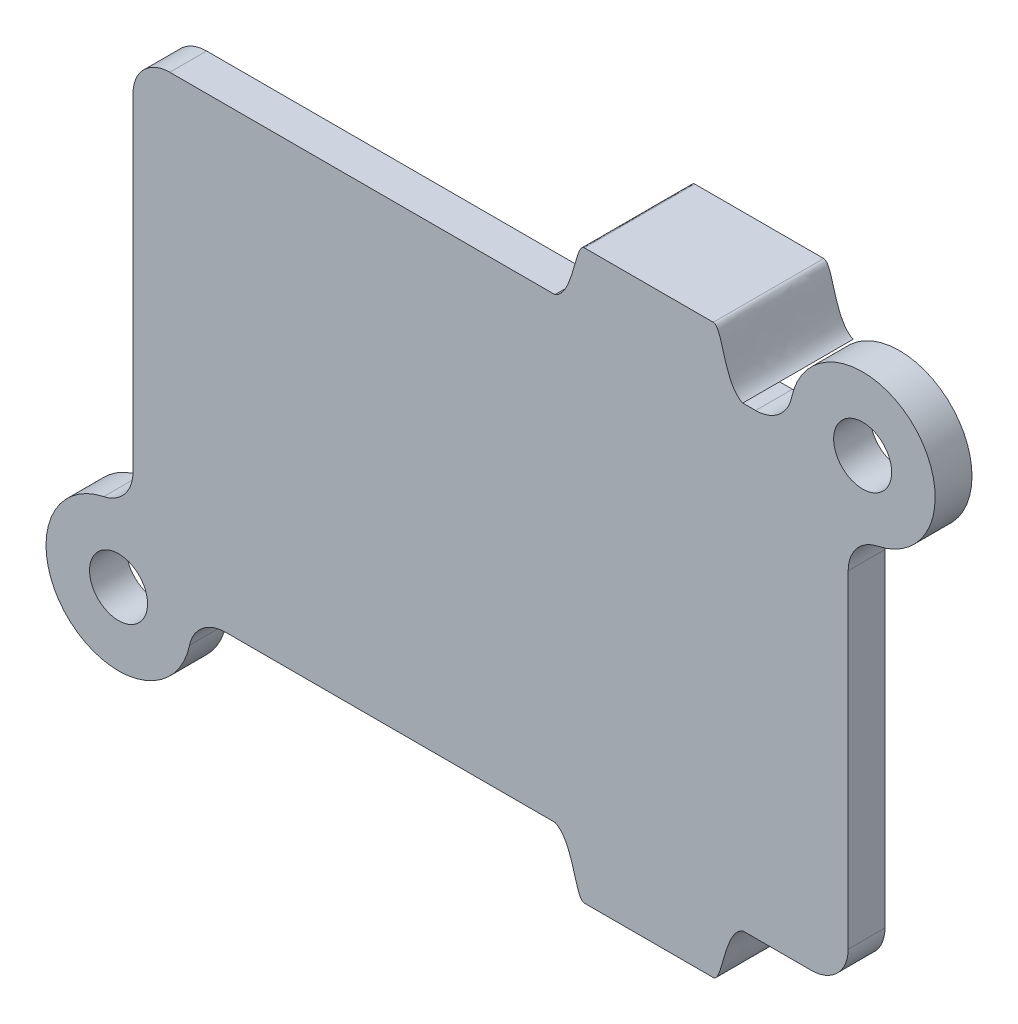
ISO-10303-21;
HEADER;
FILE_DESCRIPTION(('STEP AP214'),'2;1');
FILE_NAME('part.step','',(''),(''),'','','');
FILE_SCHEMA(('AUTOMOTIVE_DESIGN { 1 0 10303 214 1 1 1 1 }'));
ENDSEC;
DATA;
#1=APPLICATION_CONTEXT('core data for automotive mechanical design processes');
#2=APPLICATION_PROTOCOL_DEFINITION('international standard','automotive_design',2000,#1);
#3=PRODUCT_CONTEXT('',#1,'mechanical');
#4=PRODUCT('Part','Part','',(#3));
#5=PRODUCT_RELATED_PRODUCT_CATEGORY('part','',(#4));
#6=PRODUCT_DEFINITION_FORMATION('','',#4);
#7=PRODUCT_DEFINITION_CONTEXT('part definition',#1,'design');
#8=PRODUCT_DEFINITION('design','',#6,#7);
#9=PRODUCT_DEFINITION_SHAPE('','',#8);
#10=(LENGTH_UNIT() NAMED_UNIT(*) SI_UNIT(.MILLI.,.METRE.));
#11=(NAMED_UNIT(*) PLANE_ANGLE_UNIT() SI_UNIT($,.RADIAN.));
#12=(NAMED_UNIT(*) SI_UNIT($,.STERADIAN.) SOLID_ANGLE_UNIT());
#13=UNCERTAINTY_MEASURE_WITH_UNIT(LENGTH_MEASURE(1.E-05),#10,'distance_accuracy_value','');
#14=(GEOMETRIC_REPRESENTATION_CONTEXT(3) GLOBAL_UNCERTAINTY_ASSIGNED_CONTEXT((#13)) GLOBAL_UNIT_ASSIGNED_CONTEXT((#10,
#11,#12)) REPRESENTATION_CONTEXT('',''));
#15=CARTESIAN_POINT('',(0.,0.,0.));
#16=DIRECTION('',(0.,0.,1.));
#17=DIRECTION('',(1.,0.,0.));
#18=AXIS2_PLACEMENT_3D('',#15,#16,#17);
#19=CARTESIAN_POINT('',(0.,9.84105518988354,2.54));
#20=DIRECTION('',(0.,-1.,0.));
#21=DIRECTION('',(1.,0.,0.));
#22=AXIS2_PLACEMENT_3D('',#19,#20,#21);
#23=PLANE('',#22);
#24=DIRECTION('',(0.,0.,1.));
#25=VECTOR('',#24,1.);
#26=CARTESIAN_POINT('',(33.6454710930899,9.84105518988354,-5.08));
#27=LINE('',#26,#25);
#28=CARTESIAN_POINT('',(33.6454710930899,9.84105518988354,0.));
#29=VERTEX_POINT('',#28);
#30=CARTESIAN_POINT('',(33.6454710930899,9.84105518988354,2.54));
#31=VERTEX_POINT('',#30);
#32=EDGE_CURVE('E58',#29,#31,#27,.T.);
#33=ORIENTED_EDGE('',*,*,#32,.T.);
#34=DIRECTION('',(-1.,0.,0.));
#35=VECTOR('',#34,1.);
#36=CARTESIAN_POINT('',(0.,9.84105518988354,2.54));
#37=LINE('',#36,#35);
#38=CARTESIAN_POINT('',(34.5322363971184,9.84105518988354,2.54));
#39=VERTEX_POINT('',#38);
#40=EDGE_CURVE('E305',#39,#31,#37,.T.);
#41=ORIENTED_EDGE('',*,*,#40,.F.);
#42=DIRECTION('',(0.,0.,-1.));
#43=VECTOR('',#42,1.);
#44=CARTESIAN_POINT('',(34.5322363971184,9.84105518988354,2.54));
#45=LINE('',#44,#43);
#46=CARTESIAN_POINT('',(34.5322363971184,9.84105518988354,0.));
#47=VERTEX_POINT('',#46);
#48=EDGE_CURVE('E394',#39,#47,#45,.T.);
#49=ORIENTED_EDGE('',*,*,#48,.T.);
#50=DIRECTION('',(-1.,0.,0.));
#51=VECTOR('',#50,1.);
#52=CARTESIAN_POINT('',(0.,9.84105518988354,0.));
#53=LINE('',#52,#51);
#54=EDGE_CURVE('E345',#47,#29,#53,.T.);
#55=ORIENTED_EDGE('',*,*,#54,.T.);
#56=EDGE_LOOP('',(#33,#41,#49,#55));
#57=FACE_BOUND('',#56,.T.);
#58=ADVANCED_FACE('F35',(#57),#23,.F.);
#59=CARTESIAN_POINT('',(0.,-21.6930448101165,2.54));
#60=DIRECTION('',(0.,1.,0.));
#61=DIRECTION('',(0.,0.,1.));
#62=AXIS2_PLACEMENT_3D('',#59,#60,#61);
#63=PLANE('',#62);
#64=DIRECTION('',(0.,0.,1.));
#65=VECTOR('',#64,1.);
#66=CARTESIAN_POINT('',(20.6905883156182,-21.6930448101165,-5.08));
#67=LINE('',#66,#65);
#68=CARTESIAN_POINT('',(20.6905883156182,-21.6930448101165,0.));
#69=VERTEX_POINT('',#68);
#70=CARTESIAN_POINT('',(20.6905883156182,-21.6930448101165,2.54));
#71=VERTEX_POINT('',#70);
#72=EDGE_CURVE('E252',#69,#71,#67,.T.);
#73=ORIENTED_EDGE('',*,*,#72,.T.);
#74=DIRECTION('',(1.,0.,0.));
#75=VECTOR('',#74,1.);
#76=CARTESIAN_POINT('',(0.,-21.6930448101165,2.54));
#77=LINE('',#76,#75);
#78=CARTESIAN_POINT('',(-2.03457062658988,-21.6930448101165,2.54));
#79=VERTEX_POINT('',#78);
#80=EDGE_CURVE('E321',#79,#71,#77,.T.);
#81=ORIENTED_EDGE('',*,*,#80,.F.);
#82=DIRECTION('',(0.,0.,-1.));
#83=VECTOR('',#82,1.);
#84=CARTESIAN_POINT('',(-2.03457062658988,-21.6930448101165,2.54));
#85=LINE('',#84,#83);
#86=CARTESIAN_POINT('',(-2.03457062658988,-21.6930448101165,0.));
#87=VERTEX_POINT('',#86);
#88=EDGE_CURVE('E380',#79,#87,#85,.T.);
#89=ORIENTED_EDGE('',*,*,#88,.T.);
#90=DIRECTION('',(1.,0.,0.));
#91=VECTOR('',#90,1.);
#92=CARTESIAN_POINT('',(0.,-21.6930448101165,0.));
#93=LINE('',#92,#91);
#94=EDGE_CURVE('E364',#87,#69,#93,.T.);
#95=ORIENTED_EDGE('',*,*,#94,.T.);
#96=EDGE_LOOP('',(#73,#81,#89,#95));
#97=FACE_BOUND('',#96,.T.);
#98=ADVANCED_FACE('F466',(#97),#63,.F.);
#99=CARTESIAN_POINT('',(43.4585828852643,3.45470870173768,2.54));
#100=DIRECTION('',(0.,0.,-1.));
#101=DIRECTION('',(-1.,0.,0.));
#102=AXIS2_PLACEMENT_3D('',#99,#100,#101);
#103=CYLINDRICAL_SURFACE('',#102,2.54);
#104=CARTESIAN_POINT('',(43.4585828852643,3.45470870173768,0.));
#105=DIRECTION('',(0.,0.,1.));
#106=DIRECTION('',(1.,0.,0.));
#107=AXIS2_PLACEMENT_3D('',#104,#105,#106);
#108=CIRCLE('',#107,2.54);
#109=CARTESIAN_POINT('',(42.9394653471165,5.94109503165253,0.));
#110=VERTEX_POINT('',#109);
#111=CARTESIAN_POINT('',(40.9185828852643,3.45470870173768,0.));
#112=VERTEX_POINT('',#111);
#113=EDGE_CURVE('E335',#110,#112,#108,.T.);
#114=ORIENTED_EDGE('',*,*,#113,.F.);
#115=DIRECTION('',(0.,0.,-1.));
#116=VECTOR('',#115,1.);
#117=CARTESIAN_POINT('',(42.9394653471165,5.94109503165253,2.54));
#118=LINE('',#117,#116);
#119=CARTESIAN_POINT('',(42.9394653471165,5.94109503165253,2.54));
#120=VERTEX_POINT('',#119);
#121=EDGE_CURVE('E11',#120,#110,#118,.T.);
#122=ORIENTED_EDGE('',*,*,#121,.F.);
#123=CARTESIAN_POINT('',(43.4585828852643,3.45470870173768,2.54));
#124=DIRECTION('',(0.,0.,1.));
#125=DIRECTION('',(1.,0.,0.));
#126=AXIS2_PLACEMENT_3D('',#123,#124,#125);
#127=CIRCLE('',#126,2.54);
#128=CARTESIAN_POINT('',(40.9185828852643,3.45470870173768,2.54));
#129=VERTEX_POINT('',#128);
#130=EDGE_CURVE('E297',#120,#129,#127,.T.);
#131=ORIENTED_EDGE('',*,*,#130,.T.);
#132=DIRECTION('',(0.,0.,-1.));
#133=VECTOR('',#132,1.);
#134=CARTESIAN_POINT('',(40.9185828852643,3.45470870173768,2.54));
#135=LINE('',#134,#133);
#136=EDGE_CURVE('E329',#129,#112,#135,.T.);
#137=ORIENTED_EDGE('',*,*,#136,.T.);
#138=EDGE_LOOP('',(#114,#122,#131,#137));
#139=FACE_BOUND('',#138,.T.);
#140=ADVANCED_FACE('F414',(#139),#103,.F.);
#141=CARTESIAN_POINT('',(41.9168037969655,10.8392761015848,2.54));
#142=DIRECTION('',(0.,0.,-1.));
#143=DIRECTION('',(-1.,0.,0.));
#144=AXIS2_PLACEMENT_3D('',#141,#142,#143);
#145=CYLINDRICAL_SURFACE('',#144,5.0038);
#146=CARTESIAN_POINT('',(41.9168037969655,10.8392761015848,0.));
#147=DIRECTION('',(0.,0.,1.));
#148=DIRECTION('',(1.,0.,0.));
#149=AXIS2_PLACEMENT_3D('',#146,#147,#148);
#150=CIRCLE('',#149,5.0038);
#151=CARTESIAN_POINT('',(37.0186227270332,11.8619376517358,0.));
#152=VERTEX_POINT('',#151);
#153=EDGE_CURVE('E338',#110,#152,#150,.T.);
#154=ORIENTED_EDGE('',*,*,#153,.T.);
#155=DIRECTION('',(0.,0.,-1.));
#156=VECTOR('',#155,1.);
#157=CARTESIAN_POINT('',(37.0186227270332,11.8619376517358,2.54));
#158=LINE('',#157,#156);
#159=CARTESIAN_POINT('',(37.0186227270332,11.8619376517358,2.54));
#160=VERTEX_POINT('',#159);
#161=EDGE_CURVE('E43',#160,#152,#158,.T.);
#162=ORIENTED_EDGE('',*,*,#161,.F.);
#163=CARTESIAN_POINT('',(41.9168037969655,10.8392761015848,2.54));
#164=DIRECTION('',(0.,0.,1.));
#165=DIRECTION('',(1.,0.,0.));
#166=AXIS2_PLACEMENT_3D('',#163,#164,#165);
#167=CIRCLE('',#166,5.0038);
#168=EDGE_CURVE('E300',#120,#160,#167,.T.);
#169=ORIENTED_EDGE('',*,*,#168,.F.);
#170=ORIENTED_EDGE('',*,*,#121,.T.);
#171=EDGE_LOOP('',(#154,#162,#169,#170));
#172=FACE_BOUND('',#171,.T.);
#173=ADVANCED_FACE('F403',(#172),#145,.T.);
#174=CARTESIAN_POINT('',(34.5322363971184,12.3810551898835,2.54));
#175=DIRECTION('',(0.,0.,-1.));
#176=DIRECTION('',(-1.,0.,0.));
#177=AXIS2_PLACEMENT_3D('',#174,#175,#176);
#178=CYLINDRICAL_SURFACE('',#177,2.54);
#179=CARTESIAN_POINT('',(34.5322363971184,12.3810551898835,0.));
#180=DIRECTION('',(0.,0.,1.));
#181=DIRECTION('',(1.,0.,0.));
#182=AXIS2_PLACEMENT_3D('',#179,#180,#181);
#183=CIRCLE('',#182,2.54);
#184=EDGE_CURVE('E341',#47,#152,#183,.T.);
#185=ORIENTED_EDGE('',*,*,#184,.F.);
#186=ORIENTED_EDGE('',*,*,#48,.F.);
#187=CARTESIAN_POINT('',(34.5322363971184,12.3810551898835,2.54));
#188=DIRECTION('',(0.,0.,1.));
#189=DIRECTION('',(1.,0.,0.));
#190=AXIS2_PLACEMENT_3D('',#187,#188,#189);
#191=CIRCLE('',#190,2.54);
#192=EDGE_CURVE('E302',#39,#160,#191,.T.);
#193=ORIENTED_EDGE('',*,*,#192,.T.);
#194=ORIENTED_EDGE('',*,*,#161,.T.);
#195=EDGE_LOOP('',(#185,#186,#193,#194));
#196=FACE_BOUND('',#195,.T.);
#197=ADVANCED_FACE('F398',(#196),#178,.F.);
#198=CARTESIAN_POINT('',(20.6905883156182,9.84105518988354,2.54));
#199=VERTEX_POINT('',#198);
#200=CARTESIAN_POINT('',(-5.88091711473574,9.84105518988354,2.54));
#201=VERTEX_POINT('',#200);
#202=EDGE_CURVE('E50',#199,#201,#37,.T.);
#203=ORIENTED_EDGE('',*,*,#202,.F.);
#204=DIRECTION('',(0.,0.,1.));
#205=VECTOR('',#204,1.);
#206=CARTESIAN_POINT('',(20.6905883156182,9.84105518988354,-5.08));
#207=LINE('',#206,#205);
#208=CARTESIAN_POINT('',(20.6905883156182,9.84105518988354,0.));
#209=VERTEX_POINT('',#208);
#210=EDGE_CURVE('E765',#209,#199,#207,.T.);
#211=ORIENTED_EDGE('',*,*,#210,.F.);
#212=CARTESIAN_POINT('',(-5.88091711473574,9.84105518988354,0.));
#213=VERTEX_POINT('',#212);
#214=EDGE_CURVE('E344',#209,#213,#53,.T.);
#215=ORIENTED_EDGE('',*,*,#214,.T.);
#216=DIRECTION('',(0.,0.,-1.));
#217=VECTOR('',#216,1.);
#218=CARTESIAN_POINT('',(-5.88091711473574,9.84105518988354,2.54));
#219=LINE('',#218,#217);
#220=EDGE_CURVE('E391',#201,#213,#219,.T.);
#221=ORIENTED_EDGE('',*,*,#220,.F.);
#222=EDGE_LOOP('',(#203,#211,#215,#221));
#223=FACE_BOUND('',#222,.T.);
#224=ADVANCED_FACE('F485',(#223),#23,.F.);
#225=CARTESIAN_POINT('',(-5.88091711473574,7.30105518988354,2.54));
#226=DIRECTION('',(0.,0.,-1.));
#227=DIRECTION('',(-1.,0.,0.));
#228=AXIS2_PLACEMENT_3D('',#225,#226,#227);
#229=CYLINDRICAL_SURFACE('',#228,2.54);
#230=CARTESIAN_POINT('',(-5.88091711473574,7.30105518988354,0.));
#231=DIRECTION('',(0.,0.,1.));
#232=DIRECTION('',(1.,0.,0.));
#233=AXIS2_PLACEMENT_3D('',#230,#231,#232);
#234=CIRCLE('',#233,2.54);
#235=CARTESIAN_POINT('',(-8.42091711473574,7.30105518988354,0.));
#236=VERTEX_POINT('',#235);
#237=EDGE_CURVE('E347',#213,#236,#234,.T.);
#238=ORIENTED_EDGE('',*,*,#237,.T.);
#239=DIRECTION('',(0.,0.,-1.));
#240=VECTOR('',#239,1.);
#241=CARTESIAN_POINT('',(-8.42091711473574,7.30105518988354,2.54));
#242=LINE('',#241,#240);
#243=CARTESIAN_POINT('',(-8.42091711473574,7.30105518988354,2.54));
#244=VERTEX_POINT('',#243);
#245=EDGE_CURVE('E388',#244,#236,#242,.T.);
#246=ORIENTED_EDGE('',*,*,#245,.F.);
#247=CARTESIAN_POINT('',(-5.88091711473574,7.30105518988354,2.54));
#248=DIRECTION('',(0.,0.,1.));
#249=DIRECTION('',(1.,0.,0.));
#250=AXIS2_PLACEMENT_3D('',#247,#248,#249);
#251=CIRCLE('',#250,2.54);
#252=EDGE_CURVE('E307',#201,#244,#251,.T.);
#253=ORIENTED_EDGE('',*,*,#252,.F.);
#254=ORIENTED_EDGE('',*,*,#220,.T.);
#255=EDGE_LOOP('',(#238,#246,#253,#254));
#256=FACE_BOUND('',#255,.T.);
#257=ADVANCED_FACE('F481',(#256),#229,.T.);
#258=CARTESIAN_POINT('',(-8.42091711473574,0.,2.54));
#259=DIRECTION('',(1.,0.,0.));
#260=DIRECTION('',(0.,0.,-1.));
#261=AXIS2_PLACEMENT_3D('',#258,#259,#260);
#262=PLANE('',#261);
#263=DIRECTION('',(0.,-1.,0.));
#264=VECTOR('',#263,1.);
#265=CARTESIAN_POINT('',(-8.42091711473574,0.,0.));
#266=LINE('',#265,#264);
#267=CARTESIAN_POINT('',(-8.42091711473574,-15.3066983219706,0.));
#268=VERTEX_POINT('',#267);
#269=EDGE_CURVE('E351',#236,#268,#266,.T.);
#270=ORIENTED_EDGE('',*,*,#269,.T.);
#271=DIRECTION('',(0.,0.,-1.));
#272=VECTOR('',#271,1.);
#273=CARTESIAN_POINT('',(-8.42091711473574,-15.3066983219706,2.54));
#274=LINE('',#273,#272);
#275=CARTESIAN_POINT('',(-8.42091711473574,-15.3066983219706,2.54));
#276=VERTEX_POINT('',#275);
#277=EDGE_CURVE('E386',#276,#268,#274,.T.);
#278=ORIENTED_EDGE('',*,*,#277,.F.);
#279=DIRECTION('',(0.,-1.,0.));
#280=VECTOR('',#279,1.);
#281=CARTESIAN_POINT('',(-8.42091711473574,0.,2.54));
#282=LINE('',#281,#280);
#283=EDGE_CURVE('E310',#244,#276,#282,.T.);
#284=ORIENTED_EDGE('',*,*,#283,.F.);
#285=ORIENTED_EDGE('',*,*,#245,.T.);
#286=EDGE_LOOP('',(#270,#278,#284,#285));
#287=FACE_BOUND('',#286,.T.);
#288=ADVANCED_FACE('F477',(#287),#262,.F.);
#289=CARTESIAN_POINT('',(-10.9609171147357,-15.3066983219706,2.54));
#290=DIRECTION('',(0.,0.,-1.));
#291=DIRECTION('',(-1.,0.,0.));
#292=AXIS2_PLACEMENT_3D('',#289,#290,#291);
#293=CYLINDRICAL_SURFACE('',#292,2.54);
#294=CARTESIAN_POINT('',(-10.9609171147357,-15.3066983219706,0.));
#295=DIRECTION('',(0.,0.,1.));
#296=DIRECTION('',(1.,0.,0.));
#297=AXIS2_PLACEMENT_3D('',#294,#295,#296);
#298=CIRCLE('',#297,2.54);
#299=CARTESIAN_POINT('',(-10.441799576588,-17.7930846518854,0.));
#300=VERTEX_POINT('',#299);
#301=EDGE_CURVE('E354',#300,#268,#298,.T.);
#302=ORIENTED_EDGE('',*,*,#301,.F.);
#303=DIRECTION('',(0.,0.,-1.));
#304=VECTOR('',#303,1.);
#305=CARTESIAN_POINT('',(-10.441799576588,-17.7930846518854,2.54));
#306=LINE('',#305,#304);
#307=CARTESIAN_POINT('',(-10.441799576588,-17.7930846518854,2.54));
#308=VERTEX_POINT('',#307);
#309=EDGE_CURVE('E384',#308,#300,#306,.T.);
#310=ORIENTED_EDGE('',*,*,#309,.F.);
#311=CARTESIAN_POINT('',(-10.9609171147357,-15.3066983219706,2.54));
#312=DIRECTION('',(0.,0.,1.));
#313=DIRECTION('',(1.,0.,0.));
#314=AXIS2_PLACEMENT_3D('',#311,#312,#313);
#315=CIRCLE('',#314,2.54);
#316=EDGE_CURVE('E312',#308,#276,#315,.T.);
#317=ORIENTED_EDGE('',*,*,#316,.T.);
#318=ORIENTED_EDGE('',*,*,#277,.T.);
#319=EDGE_LOOP('',(#302,#310,#317,#318));
#320=FACE_BOUND('',#319,.T.);
#321=ADVANCED_FACE('F473',(#320),#293,.F.);
#322=CARTESIAN_POINT('',(-9.41913802643698,-22.6912657218177,2.54));
#323=DIRECTION('',(0.,0.,-1.));
#324=DIRECTION('',(-1.,0.,0.));
#325=AXIS2_PLACEMENT_3D('',#322,#323,#324);
#326=CYLINDRICAL_SURFACE('',#325,5.0038);
#327=CARTESIAN_POINT('',(-9.41913802643698,-22.6912657218177,0.));
#328=DIRECTION('',(0.,0.,1.));
#329=DIRECTION('',(1.,0.,0.));
#330=AXIS2_PLACEMENT_3D('',#327,#328,#329);
#331=CIRCLE('',#330,5.0038);
#332=CARTESIAN_POINT('',(-4.52095695650473,-23.7139272719687,0.));
#333=VERTEX_POINT('',#332);
#334=EDGE_CURVE('E357',#300,#333,#331,.T.);
#335=ORIENTED_EDGE('',*,*,#334,.T.);
#336=DIRECTION('',(0.,0.,-1.));
#337=VECTOR('',#336,1.);
#338=CARTESIAN_POINT('',(-4.52095695650473,-23.7139272719687,2.54));
#339=LINE('',#338,#337);
#340=CARTESIAN_POINT('',(-4.52095695650473,-23.7139272719687,2.54));
#341=VERTEX_POINT('',#340);
#342=EDGE_CURVE('E382',#341,#333,#339,.T.);
#343=ORIENTED_EDGE('',*,*,#342,.F.);
#344=CARTESIAN_POINT('',(-9.41913802643698,-22.6912657218177,2.54));
#345=DIRECTION('',(0.,0.,1.));
#346=DIRECTION('',(1.,0.,0.));
#347=AXIS2_PLACEMENT_3D('',#344,#345,#346);
#348=CIRCLE('',#347,5.0038);
#349=EDGE_CURVE('E315',#308,#341,#348,.T.);
#350=ORIENTED_EDGE('',*,*,#349,.F.);
#351=ORIENTED_EDGE('',*,*,#309,.T.);
#352=EDGE_LOOP('',(#335,#343,#350,#351));
#353=FACE_BOUND('',#352,.T.);
#354=ADVANCED_FACE('F469',(#353),#326,.T.);
#355=CARTESIAN_POINT('',(-2.03457062658988,-24.2330448101165,2.54));
#356=DIRECTION('',(0.,0.,-1.));
#357=DIRECTION('',(-1.,0.,0.));
#358=AXIS2_PLACEMENT_3D('',#355,#356,#357);
#359=CYLINDRICAL_SURFACE('',#358,2.54);
#360=CARTESIAN_POINT('',(-2.03457062658988,-24.2330448101165,0.));
#361=DIRECTION('',(0.,0.,1.));
#362=DIRECTION('',(1.,0.,0.));
#363=AXIS2_PLACEMENT_3D('',#360,#361,#362);
#364=CIRCLE('',#363,2.54);
#365=EDGE_CURVE('E360',#87,#333,#364,.T.);
#366=ORIENTED_EDGE('',*,*,#365,.F.);
#367=ORIENTED_EDGE('',*,*,#88,.F.);
#368=CARTESIAN_POINT('',(-2.03457062658988,-24.2330448101165,2.54));
#369=DIRECTION('',(0.,0.,1.));
#370=DIRECTION('',(1.,0.,0.));
#371=AXIS2_PLACEMENT_3D('',#368,#369,#370);
#372=CIRCLE('',#371,2.54);
#373=EDGE_CURVE('E317',#79,#341,#372,.T.);
#374=ORIENTED_EDGE('',*,*,#373,.T.);
#375=ORIENTED_EDGE('',*,*,#342,.T.);
#376=EDGE_LOOP('',(#366,#367,#374,#375));
#377=FACE_BOUND('',#376,.T.);
#378=ADVANCED_FACE('F465',(#377),#359,.F.);
#379=CARTESIAN_POINT('',(33.6454710930899,-21.6930448101165,2.54));
#380=VERTEX_POINT('',#379);
#381=CARTESIAN_POINT('',(38.3785828852643,-21.6930448101165,2.54));
#382=VERTEX_POINT('',#381);
#383=EDGE_CURVE('E320',#380,#382,#77,.T.);
#384=ORIENTED_EDGE('',*,*,#383,.F.);
#385=DIRECTION('',(0.,0.,1.));
#386=VECTOR('',#385,1.);
#387=CARTESIAN_POINT('',(33.6454710930899,-21.6930448101165,-5.08));
#388=LINE('',#387,#386);
#389=CARTESIAN_POINT('',(33.6454710930899,-21.6930448101165,0.));
#390=VERTEX_POINT('',#389);
#391=EDGE_CURVE('E282',#390,#380,#388,.T.);
#392=ORIENTED_EDGE('',*,*,#391,.F.);
#393=CARTESIAN_POINT('',(38.3785828852643,-21.6930448101165,0.));
#394=VERTEX_POINT('',#393);
#395=EDGE_CURVE('E363',#390,#394,#93,.T.);
#396=ORIENTED_EDGE('',*,*,#395,.T.);
#397=DIRECTION('',(0.,0.,-1.));
#398=VECTOR('',#397,1.);
#399=CARTESIAN_POINT('',(38.3785828852643,-21.6930448101165,2.54));
#400=LINE('',#399,#398);
#401=EDGE_CURVE('E377',#382,#394,#400,.T.);
#402=ORIENTED_EDGE('',*,*,#401,.F.);
#403=EDGE_LOOP('',(#384,#392,#396,#402));
#404=FACE_BOUND('',#403,.T.);
#405=ADVANCED_FACE('F424',(#404),#63,.F.);
#406=CARTESIAN_POINT('',(38.3785828852643,-19.1530448101165,2.54));
#407=DIRECTION('',(0.,0.,-1.));
#408=DIRECTION('',(-1.,0.,0.));
#409=AXIS2_PLACEMENT_3D('',#406,#407,#408);
#410=CYLINDRICAL_SURFACE('',#409,2.54);
#411=CARTESIAN_POINT('',(38.3785828852643,-19.1530448101165,0.));
#412=DIRECTION('',(0.,0.,1.));
#413=DIRECTION('',(1.,0.,0.));
#414=AXIS2_PLACEMENT_3D('',#411,#412,#413);
#415=CIRCLE('',#414,2.54);
#416=CARTESIAN_POINT('',(40.9185828852643,-19.1530448101165,0.));
#417=VERTEX_POINT('',#416);
#418=EDGE_CURVE('E367',#394,#417,#415,.T.);
#419=ORIENTED_EDGE('',*,*,#418,.T.);
#420=DIRECTION('',(0.,0.,-1.));
#421=VECTOR('',#420,1.);
#422=CARTESIAN_POINT('',(40.9185828852643,-19.1530448101165,2.54));
#423=LINE('',#422,#421);
#424=CARTESIAN_POINT('',(40.9185828852643,-19.1530448101165,2.54));
#425=VERTEX_POINT('',#424);
#426=EDGE_CURVE('E374',#425,#417,#423,.T.);
#427=ORIENTED_EDGE('',*,*,#426,.F.);
#428=CARTESIAN_POINT('',(38.3785828852643,-19.1530448101165,2.54));
#429=DIRECTION('',(0.,0.,1.));
#430=DIRECTION('',(1.,0.,0.));
#431=AXIS2_PLACEMENT_3D('',#428,#429,#430);
#432=CIRCLE('',#431,2.54);
#433=EDGE_CURVE('E324',#382,#425,#432,.T.);
#434=ORIENTED_EDGE('',*,*,#433,.F.);
#435=ORIENTED_EDGE('',*,*,#401,.T.);
#436=EDGE_LOOP('',(#419,#427,#434,#435));
#437=FACE_BOUND('',#436,.T.);
#438=ADVANCED_FACE('F421',(#437),#410,.T.);
#439=CARTESIAN_POINT('',(41.9168037969655,10.8392761015848,2.54));
#440=DIRECTION('',(0.,0.,-1.));
#441=DIRECTION('',(-1.,0.,0.));
#442=AXIS2_PLACEMENT_3D('',#439,#440,#441);
#443=CYLINDRICAL_SURFACE('',#442,2.);
#444=CARTESIAN_POINT('',(41.9168037969655,10.8392761015848,2.54));
#445=DIRECTION('',(0.,0.,1.));
#446=DIRECTION('',(1.,0.,0.));
#447=AXIS2_PLACEMENT_3D('',#444,#445,#446);
#448=CIRCLE('',#447,2.);
#449=CARTESIAN_POINT('',(43.9168037969655,10.8392761015848,2.54));
#450=VERTEX_POINT('',#449);
#451=EDGE_CURVE('E293',#450,#450,#448,.T.);
#452=ORIENTED_EDGE('',*,*,#451,.T.);
#453=EDGE_LOOP('',(#452));
#454=FACE_BOUND('',#453,.T.);
#455=CARTESIAN_POINT('',(41.9168037969655,10.8392761015848,0.));
#456=DIRECTION('',(0.,0.,1.));
#457=DIRECTION('',(1.,0.,0.));
#458=AXIS2_PLACEMENT_3D('',#455,#456,#457);
#459=CIRCLE('',#458,2.);
#460=CARTESIAN_POINT('',(43.9168037969655,10.8392761015848,0.));
#461=VERTEX_POINT('',#460);
#462=EDGE_CURVE('E332',#461,#461,#459,.T.);
#463=ORIENTED_EDGE('',*,*,#462,.F.);
#464=EDGE_LOOP('',(#463));
#465=FACE_BOUND('',#464,.T.);
#466=ADVANCED_FACE('F462',(#454,#465),#443,.F.);
#467=CARTESIAN_POINT('',(-9.41913802643698,-22.6912657218177,2.54));
#468=DIRECTION('',(0.,0.,-1.));
#469=DIRECTION('',(-1.,0.,0.));
#470=AXIS2_PLACEMENT_3D('',#467,#468,#469);
#471=CYLINDRICAL_SURFACE('',#470,2.);
#472=CARTESIAN_POINT('',(-9.41913802643698,-22.6912657218177,2.54));
#473=DIRECTION('',(0.,0.,1.));
#474=DIRECTION('',(1.,0.,0.));
#475=AXIS2_PLACEMENT_3D('',#472,#473,#474);
#476=CIRCLE('',#475,2.);
#477=CARTESIAN_POINT('',(-7.41913802643698,-22.6912657218177,2.54));
#478=VERTEX_POINT('',#477);
#479=EDGE_CURVE('E290',#478,#478,#476,.T.);
#480=ORIENTED_EDGE('',*,*,#479,.T.);
#481=EDGE_LOOP('',(#480));
#482=FACE_BOUND('',#481,.T.);
#483=CARTESIAN_POINT('',(-9.41913802643698,-22.6912657218177,0.));
#484=DIRECTION('',(0.,0.,1.));
#485=DIRECTION('',(1.,0.,0.));
#486=AXIS2_PLACEMENT_3D('',#483,#484,#485);
#487=CIRCLE('',#486,2.);
#488=CARTESIAN_POINT('',(-7.41913802643698,-22.6912657218177,0.));
#489=VERTEX_POINT('',#488);
#490=EDGE_CURVE('E281',#489,#489,#487,.T.);
#491=ORIENTED_EDGE('',*,*,#490,.F.);
#492=EDGE_LOOP('',(#491));
#493=FACE_BOUND('',#492,.T.);
#494=ADVANCED_FACE('F37',(#482,#493),#471,.F.);
#495=CARTESIAN_POINT('',(40.9185828852643,0.,2.54));
#496=DIRECTION('',(-1.,0.,0.));
#497=DIRECTION('',(0.,0.,1.));
#498=AXIS2_PLACEMENT_3D('',#495,#496,#497);
#499=PLANE('',#498);
#500=DIRECTION('',(0.,1.,0.));
#501=VECTOR('',#500,1.);
#502=CARTESIAN_POINT('',(40.9185828852643,0.,0.));
#503=LINE('',#502,#501);
#504=EDGE_CURVE('E294',#417,#112,#503,.T.);
#505=ORIENTED_EDGE('',*,*,#504,.T.);
#506=ORIENTED_EDGE('',*,*,#136,.F.);
#507=DIRECTION('',(0.,1.,0.));
#508=VECTOR('',#507,1.);
#509=CARTESIAN_POINT('',(40.9185828852643,0.,2.54));
#510=LINE('',#509,#508);
#511=EDGE_CURVE('E327',#425,#129,#510,.T.);
#512=ORIENTED_EDGE('',*,*,#511,.F.);
#513=ORIENTED_EDGE('',*,*,#426,.T.);
#514=EDGE_LOOP('',(#505,#506,#512,#513));
#515=FACE_BOUND('',#514,.T.);
#516=ADVANCED_FACE('F418',(#515),#499,.F.);
#517=CARTESIAN_POINT('',(0.,0.,2.54));
#518=DIRECTION('',(0.,0.,1.));
#519=DIRECTION('',(1.,0.,0.));
#520=AXIS2_PLACEMENT_3D('',#517,#518,#519);
#521=PLANE('',#520);
#522=ORIENTED_EDGE('',*,*,#479,.F.);
#523=EDGE_LOOP('',(#522));
#524=FACE_BOUND('',#523,.T.);
#525=ORIENTED_EDGE('',*,*,#451,.F.);
#526=EDGE_LOOP('',(#525));
#527=FACE_BOUND('',#526,.T.);
#528=ORIENTED_EDGE('',*,*,#130,.F.);
#529=ORIENTED_EDGE('',*,*,#168,.T.);
#530=ORIENTED_EDGE('',*,*,#192,.F.);
#531=ORIENTED_EDGE('',*,*,#40,.T.);
#532=CARTESIAN_POINT('',(31.6130297043541,13.6510551898835,2.54));
#533=CARTESIAN_POINT('',(32.285115867015,13.6510551898835,2.54));
#534=CARTESIAN_POINT('',(32.3165184257959,10.4273707205446,2.54));
#535=CARTESIAN_POINT('',(33.6454710930899,9.84105518988354,2.54));
#536=B_SPLINE_CURVE_WITH_KNOTS('',3,(#532,#533,#534,#535),.UNSPECIFIED.,.F.,.F.,(4,4),(0.,1.),.UNSPECIFIED.);
#537=CARTESIAN_POINT('',(31.6130297043541,13.6510551898835,2.54));
#538=VERTEX_POINT('',#537);
#539=EDGE_CURVE('E748',#538,#31,#536,.T.);
#540=ORIENTED_EDGE('',*,*,#539,.F.);
#541=DIRECTION('',(1.,0.,0.));
#542=VECTOR('',#541,1.);
#543=CARTESIAN_POINT('',(0.,13.6510551898835,2.54));
#544=LINE('',#543,#542);
#545=CARTESIAN_POINT('',(22.7230297043541,13.6510551898835,2.54));
#546=VERTEX_POINT('',#545);
#547=EDGE_CURVE('E213',#546,#538,#544,.T.);
#548=ORIENTED_EDGE('',*,*,#547,.F.);
#549=CARTESIAN_POINT('',(22.7230297043541,13.6510551898835,2.54));
#550=CARTESIAN_POINT('',(22.0509435416931,13.6510551898835,2.54));
#551=CARTESIAN_POINT('',(22.0195409829123,10.4273707205446,2.54));
#552=CARTESIAN_POINT('',(20.6905883156182,9.84105518988354,2.54));
#553=B_SPLINE_CURVE_WITH_KNOTS('',3,(#549,#550,#551,#552),.UNSPECIFIED.,.F.,.F.,(4,4),(0.,1.),.UNSPECIFIED.);
#554=EDGE_CURVE('E210',#546,#199,#553,.T.);
#555=ORIENTED_EDGE('',*,*,#554,.T.);
#556=ORIENTED_EDGE('',*,*,#202,.T.);
#557=ORIENTED_EDGE('',*,*,#252,.T.);
#558=ORIENTED_EDGE('',*,*,#283,.T.);
#559=ORIENTED_EDGE('',*,*,#316,.F.);
#560=ORIENTED_EDGE('',*,*,#349,.T.);
#561=ORIENTED_EDGE('',*,*,#373,.F.);
#562=ORIENTED_EDGE('',*,*,#80,.T.);
#563=CARTESIAN_POINT('',(22.7230297043541,-25.5030448101164,2.54));
#564=CARTESIAN_POINT('',(22.0509435416931,-25.5030448101164,2.54));
#565=CARTESIAN_POINT('',(22.0195409829123,-22.2793603407775,2.54));
#566=CARTESIAN_POINT('',(20.6905883156182,-21.6930448101165,2.54));
#567=B_SPLINE_CURVE_WITH_KNOTS('',3,(#563,#564,#565,#566),.UNSPECIFIED.,.F.,.F.,(4,4),(0.,1.),.UNSPECIFIED.);
#568=CARTESIAN_POINT('',(22.7230297043541,-25.5030448101165,2.54));
#569=VERTEX_POINT('',#568);
#570=EDGE_CURVE('E255',#569,#71,#567,.T.);
#571=ORIENTED_EDGE('',*,*,#570,.F.);
#572=DIRECTION('',(1.,0.,0.));
#573=VECTOR('',#572,1.);
#574=CARTESIAN_POINT('',(0.,-25.5030448101165,2.54));
#575=LINE('',#574,#573);
#576=CARTESIAN_POINT('',(31.6130297043541,-25.5030448101165,2.54));
#577=VERTEX_POINT('',#576);
#578=EDGE_CURVE('E263',#569,#577,#575,.T.);
#579=ORIENTED_EDGE('',*,*,#578,.T.);
#580=CARTESIAN_POINT('',(31.6130297043541,-25.5030448101164,2.54));
#581=CARTESIAN_POINT('',(32.285115867015,-25.5030448101164,2.54));
#582=CARTESIAN_POINT('',(32.3165184257959,-22.2793603407775,2.54));
#583=CARTESIAN_POINT('',(33.6454710930899,-21.6930448101165,2.54));
#584=B_SPLINE_CURVE_WITH_KNOTS('',3,(#580,#581,#582,#583),.UNSPECIFIED.,.F.,.F.,(4,4),(0.,1.),.UNSPECIFIED.);
#585=EDGE_CURVE('E269',#577,#380,#584,.T.);
#586=ORIENTED_EDGE('',*,*,#585,.T.);
#587=ORIENTED_EDGE('',*,*,#383,.T.);
#588=ORIENTED_EDGE('',*,*,#433,.T.);
#589=ORIENTED_EDGE('',*,*,#511,.T.);
#590=EDGE_LOOP('',(#528,#529,#530,#531,#540,#548,#555,#556,#557,#558,#559,#560,#561,#562,#571,
#579,#586,#587,#588,#589));
#591=FACE_BOUND('',#590,.T.);
#592=ADVANCED_FACE('F411',(#524,#527,#591),#521,.T.);
#593=CARTESIAN_POINT('',(0.,0.,0.));
#594=DIRECTION('',(0.,0.,1.));
#595=DIRECTION('',(1.,0.,0.));
#596=AXIS2_PLACEMENT_3D('',#593,#594,#595);
#597=PLANE('',#596);
#598=ORIENTED_EDGE('',*,*,#490,.T.);
#599=EDGE_LOOP('',(#598));
#600=FACE_BOUND('',#599,.T.);
#601=ORIENTED_EDGE('',*,*,#462,.T.);
#602=EDGE_LOOP('',(#601));
#603=FACE_BOUND('',#602,.T.);
#604=ORIENTED_EDGE('',*,*,#113,.T.);
#605=ORIENTED_EDGE('',*,*,#504,.F.);
#606=ORIENTED_EDGE('',*,*,#418,.F.);
#607=ORIENTED_EDGE('',*,*,#395,.F.);
#608=EDGE_CURVE('E368',#69,#390,#93,.T.);
#609=ORIENTED_EDGE('',*,*,#608,.F.);
#610=ORIENTED_EDGE('',*,*,#94,.F.);
#611=ORIENTED_EDGE('',*,*,#365,.T.);
#612=ORIENTED_EDGE('',*,*,#334,.F.);
#613=ORIENTED_EDGE('',*,*,#301,.T.);
#614=ORIENTED_EDGE('',*,*,#269,.F.);
#615=ORIENTED_EDGE('',*,*,#237,.F.);
#616=ORIENTED_EDGE('',*,*,#214,.F.);
#617=EDGE_CURVE('E348',#29,#209,#53,.T.);
#618=ORIENTED_EDGE('',*,*,#617,.F.);
#619=ORIENTED_EDGE('',*,*,#54,.F.);
#620=ORIENTED_EDGE('',*,*,#184,.T.);
#621=ORIENTED_EDGE('',*,*,#153,.F.);
#622=EDGE_LOOP('',(#604,#605,#606,#607,#609,#610,#611,#612,#613,#614,#615,#616,#618,#619,#620,#621));
#623=FACE_BOUND('',#622,.T.);
#624=ADVANCED_FACE('F407',(#600,#603,#623),#597,.F.);
#625=CARTESIAN_POINT('',(0.,-21.6930448101165,-5.08));
#626=DIRECTION('',(0.,-1.,0.));
#627=DIRECTION('',(0.,0.,-1.));
#628=AXIS2_PLACEMENT_3D('',#625,#626,#627);
#629=PLANE('',#628);
#630=CARTESIAN_POINT('',(20.6905883156182,-21.6930448101165,-5.08));
#631=VERTEX_POINT('',#630);
#632=EDGE_CURVE('E287',#631,#69,#67,.T.);
#633=ORIENTED_EDGE('',*,*,#632,.T.);
#634=ORIENTED_EDGE('',*,*,#608,.T.);
#635=CARTESIAN_POINT('',(33.6454710930899,-21.6930448101165,-5.08));
#636=VERTEX_POINT('',#635);
#637=EDGE_CURVE('E275',#636,#390,#388,.T.);
#638=ORIENTED_EDGE('',*,*,#637,.F.);
#639=DIRECTION('',(1.,0.,0.));
#640=VECTOR('',#639,1.);
#641=CARTESIAN_POINT('',(0.,-21.6930448101165,-5.08));
#642=LINE('',#641,#640);
#643=EDGE_CURVE('E274',#631,#636,#642,.T.);
#644=ORIENTED_EDGE('',*,*,#643,.F.);
#645=EDGE_LOOP('',(#633,#634,#638,#644));
#646=FACE_BOUND('',#645,.T.);
#647=ADVANCED_FACE('F242',(#646),#629,.F.);
#648=CARTESIAN_POINT('',(31.6130297043541,-25.5030448101164,-5.08));
#649=CARTESIAN_POINT('',(32.285115867015,-25.5030448101164,-5.08));
#650=CARTESIAN_POINT('',(32.3165184257959,-22.2793603407775,-5.08));
#651=CARTESIAN_POINT('',(33.6454710930899,-21.6930448101165,-5.08));
#652=B_SPLINE_CURVE_WITH_KNOTS('',3,(#648,#649,#650,#651),.UNSPECIFIED.,.F.,.F.,(4,4),(0.,1.),.UNSPECIFIED.);
#653=DIRECTION('',(0.,0.,1.));
#654=VECTOR('',#653,1.);
#655=SURFACE_OF_LINEAR_EXTRUSION('',#652,#654);
#656=ORIENTED_EDGE('',*,*,#585,.F.);
#657=DIRECTION('',(0.,0.,1.));
#658=VECTOR('',#657,1.);
#659=CARTESIAN_POINT('',(31.6130297043541,-25.5030448101165,-5.08));
#660=LINE('',#659,#658);
#661=CARTESIAN_POINT('',(31.6130297043541,-25.5030448101165,-5.08));
#662=VERTEX_POINT('',#661);
#663=EDGE_CURVE('E283',#662,#577,#660,.T.);
#664=ORIENTED_EDGE('',*,*,#663,.F.);
#665=EDGE_CURVE('E245',#662,#636,#652,.T.);
#666=ORIENTED_EDGE('',*,*,#665,.T.);
#667=ORIENTED_EDGE('',*,*,#637,.T.);
#668=ORIENTED_EDGE('',*,*,#391,.T.);
#669=EDGE_LOOP('',(#656,#664,#666,#667,#668));
#670=FACE_BOUND('',#669,.T.);
#671=ADVANCED_FACE('F237',(#670),#655,.T.);
#672=CARTESIAN_POINT('',(0.,-25.5030448101165,-5.08));
#673=DIRECTION('',(0.,-1.,0.));
#674=DIRECTION('',(0.,0.,-1.));
#675=AXIS2_PLACEMENT_3D('',#672,#673,#674);
#676=PLANE('',#675);
#677=ORIENTED_EDGE('',*,*,#578,.F.);
#678=DIRECTION('',(0.,0.,1.));
#679=VECTOR('',#678,1.);
#680=CARTESIAN_POINT('',(22.7230297043541,-25.5030448101165,-5.08));
#681=LINE('',#680,#679);
#682=CARTESIAN_POINT('',(22.7230297043541,-25.5030448101165,-5.08));
#683=VERTEX_POINT('',#682);
#684=EDGE_CURVE('E285',#683,#569,#681,.T.);
#685=ORIENTED_EDGE('',*,*,#684,.F.);
#686=DIRECTION('',(1.,0.,0.));
#687=VECTOR('',#686,1.);
#688=CARTESIAN_POINT('',(0.,-25.5030448101165,-5.08));
#689=LINE('',#688,#687);
#690=EDGE_CURVE('E253',#683,#662,#689,.T.);
#691=ORIENTED_EDGE('',*,*,#690,.T.);
#692=ORIENTED_EDGE('',*,*,#663,.T.);
#693=EDGE_LOOP('',(#677,#685,#691,#692));
#694=FACE_BOUND('',#693,.T.);
#695=ADVANCED_FACE('F241',(#694),#676,.T.);
#696=CARTESIAN_POINT('',(22.7230297043541,-25.5030448101164,-5.08));
#697=CARTESIAN_POINT('',(22.0509435416931,-25.5030448101164,-5.08));
#698=CARTESIAN_POINT('',(22.0195409829123,-22.2793603407775,-5.08));
#699=CARTESIAN_POINT('',(20.6905883156182,-21.6930448101165,-5.08));
#700=B_SPLINE_CURVE_WITH_KNOTS('',3,(#696,#697,#698,#699),.UNSPECIFIED.,.F.,.F.,(4,4),(0.,1.),.UNSPECIFIED.);
#701=DIRECTION('',(0.,0.,1.));
#702=VECTOR('',#701,1.);
#703=SURFACE_OF_LINEAR_EXTRUSION('',#700,#702);
#704=ORIENTED_EDGE('',*,*,#570,.T.);
#705=ORIENTED_EDGE('',*,*,#72,.F.);
#706=ORIENTED_EDGE('',*,*,#632,.F.);
#707=EDGE_CURVE('E438',#683,#631,#700,.T.);
#708=ORIENTED_EDGE('',*,*,#707,.F.);
#709=ORIENTED_EDGE('',*,*,#684,.T.);
#710=EDGE_LOOP('',(#704,#705,#706,#708,#709));
#711=FACE_BOUND('',#710,.T.);
#712=ADVANCED_FACE('F235',(#711),#703,.F.);
#713=CARTESIAN_POINT('',(0.,0.,-5.08));
#714=DIRECTION('',(0.,0.,1.));
#715=DIRECTION('',(1.,0.,0.));
#716=AXIS2_PLACEMENT_3D('',#713,#714,#715);
#717=PLANE('',#716);
#718=ORIENTED_EDGE('',*,*,#643,.T.);
#719=ORIENTED_EDGE('',*,*,#665,.F.);
#720=ORIENTED_EDGE('',*,*,#690,.F.);
#721=ORIENTED_EDGE('',*,*,#707,.T.);
#722=EDGE_LOOP('',(#718,#719,#720,#721));
#723=FACE_BOUND('',#722,.T.);
#724=ADVANCED_FACE('F232',(#723),#717,.F.);
#725=CARTESIAN_POINT('',(0.,9.84105518988354,-5.08));
#726=DIRECTION('',(0.,1.,0.));
#727=DIRECTION('',(-1.,0.,0.));
#728=AXIS2_PLACEMENT_3D('',#725,#726,#727);
#729=PLANE('',#728);
#730=CARTESIAN_POINT('',(33.6454710930899,9.84105518988354,-5.08));
#731=VERTEX_POINT('',#730);
#732=EDGE_CURVE('E199',#731,#29,#27,.T.);
#733=ORIENTED_EDGE('',*,*,#732,.T.);
#734=ORIENTED_EDGE('',*,*,#617,.T.);
#735=CARTESIAN_POINT('',(20.6905883156182,9.84105518988354,-5.08));
#736=VERTEX_POINT('',#735);
#737=EDGE_CURVE('E208',#736,#209,#207,.T.);
#738=ORIENTED_EDGE('',*,*,#737,.F.);
#739=DIRECTION('',(-1.,0.,0.));
#740=VECTOR('',#739,1.);
#741=CARTESIAN_POINT('',(0.,9.84105518988354,-5.08));
#742=LINE('',#741,#740);
#743=EDGE_CURVE('E190',#731,#736,#742,.T.);
#744=ORIENTED_EDGE('',*,*,#743,.F.);
#745=EDGE_LOOP('',(#733,#734,#738,#744));
#746=FACE_BOUND('',#745,.T.);
#747=ADVANCED_FACE('F206',(#746),#729,.F.);
#748=CARTESIAN_POINT('',(22.7230297043541,13.6510551898835,-5.08));
#749=CARTESIAN_POINT('',(22.0509435416931,13.6510551898835,-5.08));
#750=CARTESIAN_POINT('',(22.0195409829123,10.4273707205446,-5.08));
#751=CARTESIAN_POINT('',(20.6905883156182,9.84105518988354,-5.08));
#752=B_SPLINE_CURVE_WITH_KNOTS('',3,(#748,#749,#750,#751),.UNSPECIFIED.,.F.,.F.,(4,4),(0.,1.),.UNSPECIFIED.);
#753=DIRECTION('',(0.,0.,1.));
#754=VECTOR('',#753,1.);
#755=SURFACE_OF_LINEAR_EXTRUSION('',#752,#754);
#756=ORIENTED_EDGE('',*,*,#554,.F.);
#757=DIRECTION('',(0.,0.,1.));
#758=VECTOR('',#757,1.);
#759=CARTESIAN_POINT('',(22.7230297043541,13.6510551898835,-5.08));
#760=LINE('',#759,#758);
#761=CARTESIAN_POINT('',(22.7230297043541,13.6510551898835,-5.08));
#762=VERTEX_POINT('',#761);
#763=EDGE_CURVE('E766',#762,#546,#760,.T.);
#764=ORIENTED_EDGE('',*,*,#763,.F.);
#765=EDGE_CURVE('E743',#762,#736,#752,.T.);
#766=ORIENTED_EDGE('',*,*,#765,.T.);
#767=ORIENTED_EDGE('',*,*,#737,.T.);
#768=ORIENTED_EDGE('',*,*,#210,.T.);
#769=EDGE_LOOP('',(#756,#764,#766,#767,#768));
#770=FACE_BOUND('',#769,.T.);
#771=ADVANCED_FACE('F231',(#770),#755,.T.);
#772=CARTESIAN_POINT('',(0.,13.6510551898835,-5.08));
#773=DIRECTION('',(0.,-1.,0.));
#774=DIRECTION('',(1.,0.,0.));
#775=AXIS2_PLACEMENT_3D('',#772,#773,#774);
#776=PLANE('',#775);
#777=ORIENTED_EDGE('',*,*,#547,.T.);
#778=DIRECTION('',(0.,0.,1.));
#779=VECTOR('',#778,1.);
#780=CARTESIAN_POINT('',(31.6130297043541,13.6510551898835,-5.08));
#781=LINE('',#780,#779);
#782=CARTESIAN_POINT('',(31.6130297043541,13.6510551898835,-5.08));
#783=VERTEX_POINT('',#782);
#784=EDGE_CURVE('E204',#783,#538,#781,.T.);
#785=ORIENTED_EDGE('',*,*,#784,.F.);
#786=DIRECTION('',(1.,0.,0.));
#787=VECTOR('',#786,1.);
#788=CARTESIAN_POINT('',(0.,13.6510551898835,-5.08));
#789=LINE('',#788,#787);
#790=EDGE_CURVE('E193',#762,#783,#789,.T.);
#791=ORIENTED_EDGE('',*,*,#790,.F.);
#792=ORIENTED_EDGE('',*,*,#763,.T.);
#793=EDGE_LOOP('',(#777,#785,#791,#792));
#794=FACE_BOUND('',#793,.T.);
#795=ADVANCED_FACE('F227',(#794),#776,.F.);
#796=CARTESIAN_POINT('',(31.6130297043541,13.6510551898835,-5.08));
#797=CARTESIAN_POINT('',(32.285115867015,13.6510551898835,-5.08));
#798=CARTESIAN_POINT('',(32.3165184257959,10.4273707205446,-5.08));
#799=CARTESIAN_POINT('',(33.6454710930899,9.84105518988354,-5.08));
#800=B_SPLINE_CURVE_WITH_KNOTS('',3,(#796,#797,#798,#799),.UNSPECIFIED.,.F.,.F.,(4,4),(0.,1.),.UNSPECIFIED.);
#801=DIRECTION('',(0.,0.,1.));
#802=VECTOR('',#801,1.);
#803=SURFACE_OF_LINEAR_EXTRUSION('',#800,#802);
#804=ORIENTED_EDGE('',*,*,#539,.T.);
#805=ORIENTED_EDGE('',*,*,#32,.F.);
#806=ORIENTED_EDGE('',*,*,#732,.F.);
#807=EDGE_CURVE('E185',#783,#731,#800,.T.);
#808=ORIENTED_EDGE('',*,*,#807,.F.);
#809=ORIENTED_EDGE('',*,*,#784,.T.);
#810=EDGE_LOOP('',(#804,#805,#806,#808,#809));
#811=FACE_BOUND('',#810,.T.);
#812=ADVANCED_FACE('F201',(#811),#803,.F.);
#813=CARTESIAN_POINT('',(0.,0.,-5.08));
#814=DIRECTION('',(0.,0.,1.));
#815=DIRECTION('',(1.,0.,0.));
#816=AXIS2_PLACEMENT_3D('',#813,#814,#815);
#817=PLANE('',#816);
#818=ORIENTED_EDGE('',*,*,#743,.T.);
#819=ORIENTED_EDGE('',*,*,#765,.F.);
#820=ORIENTED_EDGE('',*,*,#790,.T.);
#821=ORIENTED_EDGE('',*,*,#807,.T.);
#822=EDGE_LOOP('',(#818,#819,#820,#821));
#823=FACE_BOUND('',#822,.T.);
#824=ADVANCED_FACE('F187',(#823),#817,.F.);
#825=CLOSED_SHELL('',(#58,#98,#140,#173,#197,#224,#257,#288,#321,#354,#378,#405,#438,#466,#494,
#516,#592,#624,#647,#671,#695,#712,#724,#747,#771,#795,#812,#824));
#826=MANIFOLD_SOLID_BREP('B2',#825);
#827=ADVANCED_BREP_SHAPE_REPRESENTATION('',(#18,#826),#14);
#828=SHAPE_DEFINITION_REPRESENTATION(#9,#827);
ENDSEC;
END-ISO-10303-21;
